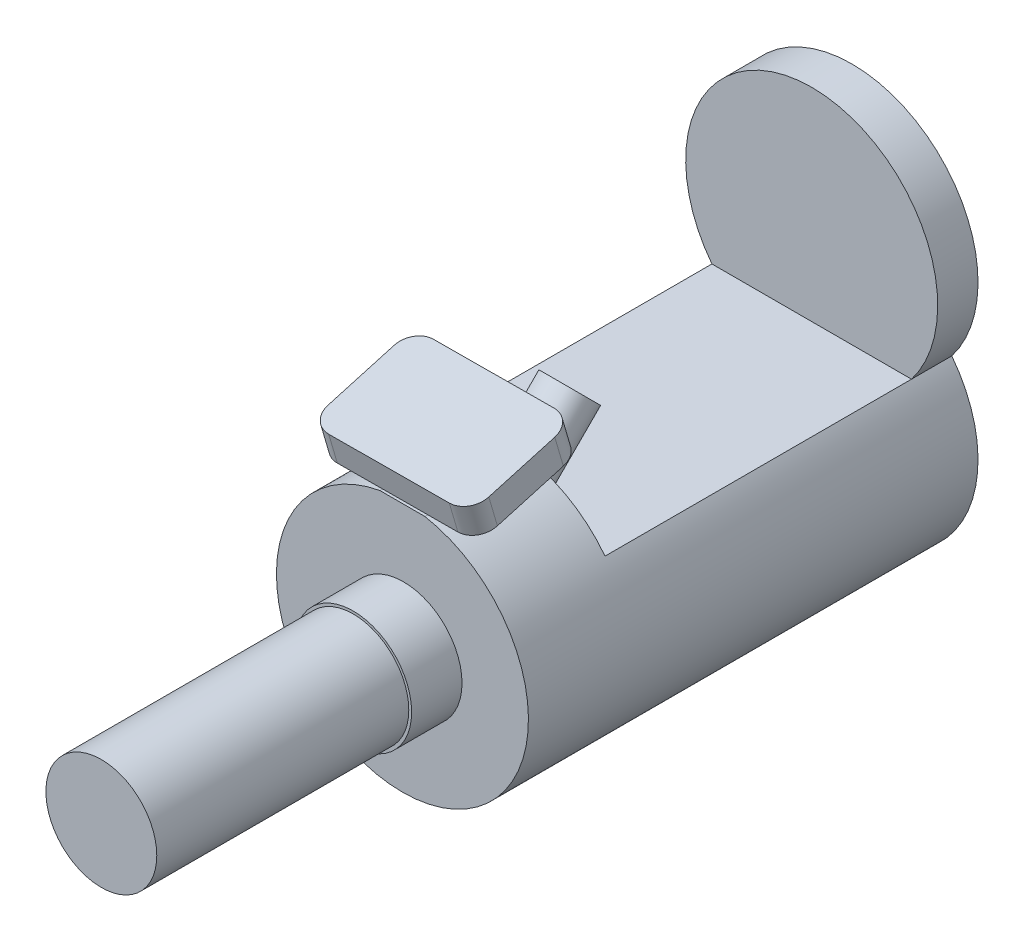
ISO-10303-21;
HEADER;
FILE_DESCRIPTION(('STEP AP214'),'2;1');
FILE_NAME('part.step','',(''),(''),'','','');
FILE_SCHEMA(('AUTOMOTIVE_DESIGN { 1 0 10303 214 1 1 1 1 }'));
ENDSEC;
DATA;
#1=APPLICATION_CONTEXT('core data for automotive mechanical design processes');
#2=APPLICATION_PROTOCOL_DEFINITION('international standard','automotive_design',2000,#1);
#3=PRODUCT_CONTEXT('',#1,'mechanical');
#4=PRODUCT('Part','Part','',(#3));
#5=PRODUCT_RELATED_PRODUCT_CATEGORY('part','',(#4));
#6=PRODUCT_DEFINITION_FORMATION('','',#4);
#7=PRODUCT_DEFINITION_CONTEXT('part definition',#1,'design');
#8=PRODUCT_DEFINITION('design','',#6,#7);
#9=PRODUCT_DEFINITION_SHAPE('','',#8);
#10=(LENGTH_UNIT() NAMED_UNIT(*) SI_UNIT(.MILLI.,.METRE.));
#11=(NAMED_UNIT(*) PLANE_ANGLE_UNIT() SI_UNIT($,.RADIAN.));
#12=(NAMED_UNIT(*) SI_UNIT($,.STERADIAN.) SOLID_ANGLE_UNIT());
#13=UNCERTAINTY_MEASURE_WITH_UNIT(LENGTH_MEASURE(1.E-05),#10,'distance_accuracy_value','');
#14=(GEOMETRIC_REPRESENTATION_CONTEXT(3) GLOBAL_UNCERTAINTY_ASSIGNED_CONTEXT((#13)) GLOBAL_UNIT_ASSIGNED_CONTEXT((#10,
#11,#12)) REPRESENTATION_CONTEXT('',''));
#15=CARTESIAN_POINT('',(0.,0.,0.));
#16=DIRECTION('',(0.,0.,1.));
#17=DIRECTION('',(1.,0.,0.));
#18=AXIS2_PLACEMENT_3D('',#15,#16,#17);
#19=CARTESIAN_POINT('',(-25.2236494622925,98.3744965262353,135.194832834219));
#20=DIRECTION('',(0.00927364020867443,-0.961523947640823,-0.274564560186648));
#21=DIRECTION('',(-0.0324577407303606,-0.274721127897378,0.960975960653269));
#22=AXIS2_PLACEMENT_3D('',#19,#20,#21);
#23=CYLINDRICAL_SURFACE('',#22,14.);
#24=CARTESIAN_POINT('',(-25.2236494622925,98.3744965262353,135.194832834219));
#25=DIRECTION('',(-0.00927364020867443,0.961523947640823,0.274564560186648));
#26=DIRECTION('',(0.0324577407303606,0.274721127897378,-0.960975960653269));
#27=AXIS2_PLACEMENT_3D('',#24,#25,#26);
#28=CIRCLE('',#27,14.);
#29=CARTESIAN_POINT('',(-24.7692410920675,102.220592316799,121.741169385073));
#30=VERTEX_POINT('',#29);
#31=EDGE_CURVE('P0_E10',#30,#30,#28,.T.);
#32=ORIENTED_EDGE('',*,*,#31,.F.);
#33=EDGE_LOOP('',(#32));
#34=FACE_BOUND('',#33,.T.);
#35=CARTESIAN_POINT('',(-25.1123657797885,86.8362091545455,131.900058111979));
#36=DIRECTION('',(0.,1.,0.));
#37=DIRECTION('',(0.0337565598964001,0.,-0.999430084930387));
#38=AXIS2_PLACEMENT_3D('',#35,#36,#37);
#39=ELLIPSE('',#38,14.560219778561,14.);
#40=CARTESIAN_POINT('',(-24.6208628487287,86.8362091545455,117.348136422087));
#41=VERTEX_POINT('',#40);
#42=EDGE_CURVE('P0_E21',#41,#41,#39,.T.);
#43=ORIENTED_EDGE('',*,*,#42,.T.);
#44=EDGE_LOOP('',(#43));
#45=FACE_BOUND('',#44,.T.);
#46=ADVANCED_FACE('P0_F15',(#34,#45),#23,.T.);
#47=CARTESIAN_POINT('',(-25.2236494622925,98.3744965262353,135.194832834219));
#48=DIRECTION('',(-0.00927364020867443,0.961523947640823,0.274564560186648));
#49=DIRECTION('',(0.0324577407303606,0.274721127897378,-0.960975960653269));
#50=AXIS2_PLACEMENT_3D('',#47,#48,#49);
#51=PLANE('',#50);
#52=ORIENTED_EDGE('',*,*,#31,.T.);
#53=EDGE_LOOP('',(#52));
#54=FACE_BOUND('',#53,.T.);
#55=ADVANCED_FACE('P0_F30',(#54),#51,.T.);
#56=CARTESIAN_POINT('',(-7.61412718210121,86.8362091545455,147.059597880007));
#57=DIRECTION('',(0.,1.,0.));
#58=DIRECTION('',(0.0337565598964001,0.,-0.999430084930387));
#59=AXIS2_PLACEMENT_3D('',#56,#57,#58);
#60=PLANE('',#59);
#61=ORIENTED_EDGE('',*,*,#42,.F.);
#62=EDGE_LOOP('',(#61));
#63=FACE_BOUND('',#62,.T.);
#64=ADVANCED_FACE('P0_F28',(#63),#60,.F.);
#65=CLOSED_SHELL('',(#46,#55,#64));
#66=MANIFOLD_SOLID_BREP('P0_B1',#65);
#67=CARTESIAN_POINT('',(-24.033694296179,25.3362091545455,156.834843864538));
#68=DIRECTION('',(0.,0.,-1.));
#69=DIRECTION('',(-1.,0.,0.));
#70=AXIS2_PLACEMENT_3D('',#67,#68,#69);
#71=CYLINDRICAL_SURFACE('',#70,62.5);
#72=DIRECTION('',(0.,0.,-1.));
#73=VECTOR('',#72,1.);
#74=CARTESIAN_POINT('',(-12.8981655705189,86.8362091545455,156.834843864538));
#75=LINE('',#74,#73);
#76=CARTESIAN_POINT('',(-12.8981655705189,86.8362091545455,156.834843864538));
#77=VERTEX_POINT('',#76);
#78=CARTESIAN_POINT('',(-12.8981655705189,86.8362091545455,105.834843864538));
#79=VERTEX_POINT('',#78);
#80=EDGE_CURVE('P1_E30',#77,#79,#75,.T.);
#81=ORIENTED_EDGE('',*,*,#80,.F.);
#82=CARTESIAN_POINT('',(-24.033694296179,25.3362091545455,156.834843864538));
#83=DIRECTION('',(0.,0.,1.));
#84=DIRECTION('',(1.,0.,0.));
#85=AXIS2_PLACEMENT_3D('',#82,#83,#84);
#86=CIRCLE('',#85,62.5);
#87=CARTESIAN_POINT('',(-35.169223021839,86.8362091545455,156.834843864538));
#88=VERTEX_POINT('',#87);
#89=EDGE_CURVE('P1_E24',#88,#77,#86,.T.);
#90=ORIENTED_EDGE('',*,*,#89,.F.);
#91=DIRECTION('',(0.,0.,-1.));
#92=VECTOR('',#91,1.);
#93=CARTESIAN_POINT('',(-35.169223021839,86.8362091545455,156.834843864538));
#94=LINE('',#93,#92);
#95=CARTESIAN_POINT('',(-35.169223021839,86.8362091545455,105.834843864538));
#96=VERTEX_POINT('',#95);
#97=EDGE_CURVE('P1_E56',#96,#88,#94,.F.);
#98=ORIENTED_EDGE('',*,*,#97,.F.);
#99=CARTESIAN_POINT('',(-24.033694296179,25.3362091545455,105.834843864538));
#100=DIRECTION('',(0.,0.,1.));
#101=DIRECTION('',(1.,0.,0.));
#102=AXIS2_PLACEMENT_3D('',#99,#100,#101);
#103=CIRCLE('',#102,62.5);
#104=CARTESIAN_POINT('',(-73.533694296179,63.4937772112233,105.834843864538));
#105=VERTEX_POINT('',#104);
#106=EDGE_CURVE('P1_E38',#96,#105,#103,.T.);
#107=ORIENTED_EDGE('',*,*,#106,.T.);
#108=DIRECTION('',(0.,0.,1.));
#109=VECTOR('',#108,1.);
#110=CARTESIAN_POINT('',(-73.533694296179,63.4937772112233,-700.625273365771));
#111=LINE('',#110,#109);
#112=CARTESIAN_POINT('',(-73.533694296179,63.4937772112233,-66.1651561354622));
#113=VERTEX_POINT('',#112);
#114=EDGE_CURVE('P1_E80',#113,#105,#111,.T.);
#115=ORIENTED_EDGE('',*,*,#114,.F.);
#116=CARTESIAN_POINT('',(-24.033694296179,25.3362091545455,-66.1651561354622));
#117=DIRECTION('',(0.,0.,1.));
#118=DIRECTION('',(1.,0.,0.));
#119=AXIS2_PLACEMENT_3D('',#116,#117,#118);
#120=CIRCLE('',#119,62.5);
#121=CARTESIAN_POINT('',(25.466305703821,63.4937772112233,-66.1651561354622));
#122=VERTEX_POINT('',#121);
#123=EDGE_CURVE('P1_E76',#113,#122,#120,.T.);
#124=ORIENTED_EDGE('',*,*,#123,.T.);
#125=DIRECTION('',(0.,0.,1.));
#126=VECTOR('',#125,1.);
#127=CARTESIAN_POINT('',(25.466305703821,63.4937772112233,-700.625273365771));
#128=LINE('',#127,#126);
#129=CARTESIAN_POINT('',(25.466305703821,63.4937772112233,105.834843864538));
#130=VERTEX_POINT('',#129);
#131=EDGE_CURVE('P1_E74',#122,#130,#128,.T.);
#132=ORIENTED_EDGE('',*,*,#131,.T.);
#133=EDGE_CURVE('P1_E68',#130,#79,#103,.T.);
#134=ORIENTED_EDGE('',*,*,#133,.T.);
#135=EDGE_LOOP('',(#81,#90,#98,#107,#115,#124,#132,#134));
#136=FACE_BOUND('',#135,.T.);
#137=ADVANCED_FACE('P1_F17',(#136),#71,.T.);
#138=CARTESIAN_POINT('',(-24.033694296179,25.3362091545455,156.834843864538));
#139=DIRECTION('',(0.,0.,1.));
#140=DIRECTION('',(1.,0.,0.));
#141=AXIS2_PLACEMENT_3D('',#138,#139,#140);
#142=PLANE('',#141);
#143=ORIENTED_EDGE('',*,*,#89,.T.);
#144=DIRECTION('',(-1.,0.,0.));
#145=VECTOR('',#144,1.);
#146=CARTESIAN_POINT('',(87.4663057038211,86.8362091545455,156.834843864538));
#147=LINE('',#146,#145);
#148=EDGE_CURVE('P1_E62',#77,#88,#147,.T.);
#149=ORIENTED_EDGE('',*,*,#148,.T.);
#150=EDGE_LOOP('',(#143,#149));
#151=FACE_BOUND('',#150,.T.);
#152=ADVANCED_FACE('P1_F87',(#151),#142,.T.);
#153=CARTESIAN_POINT('',(-24.033694296179,25.3362091545455,105.834843864538));
#154=DIRECTION('',(0.,0.,1.));
#155=DIRECTION('',(1.,0.,0.));
#156=AXIS2_PLACEMENT_3D('',#153,#154,#155);
#157=PLANE('',#156);
#158=DIRECTION('',(-1.,0.,0.));
#159=VECTOR('',#158,1.);
#160=CARTESIAN_POINT('',(-24.033694296179,86.8362091545455,105.834843864538));
#161=LINE('',#160,#159);
#162=EDGE_CURVE('P1_E11',#79,#96,#161,.T.);
#163=ORIENTED_EDGE('',*,*,#162,.F.);
#164=ORIENTED_EDGE('',*,*,#133,.F.);
#165=DIRECTION('',(1.,0.,0.));
#166=VECTOR('',#165,1.);
#167=CARTESIAN_POINT('',(25.466305703821,63.4937772112233,105.834843864538));
#168=LINE('',#167,#166);
#169=EDGE_CURVE('P1_E67',#105,#130,#168,.T.);
#170=ORIENTED_EDGE('',*,*,#169,.F.);
#171=ORIENTED_EDGE('',*,*,#106,.F.);
#172=EDGE_LOOP('',(#163,#164,#170,#171));
#173=FACE_BOUND('',#172,.T.);
#174=ADVANCED_FACE('P1_F65',(#173),#157,.F.);
#175=CARTESIAN_POINT('',(-24.033694296179,25.3362091545455,-66.1651561354622));
#176=DIRECTION('',(0.,0.,1.));
#177=DIRECTION('',(1.,0.,0.));
#178=AXIS2_PLACEMENT_3D('',#175,#176,#177);
#179=PLANE('',#178);
#180=ORIENTED_EDGE('',*,*,#123,.F.);
#181=DIRECTION('',(1.,0.,0.));
#182=VECTOR('',#181,1.);
#183=CARTESIAN_POINT('',(25.466305703821,63.4937772112233,-66.1651561354622));
#184=LINE('',#183,#182);
#185=EDGE_CURVE('P1_E70',#113,#122,#184,.T.);
#186=ORIENTED_EDGE('',*,*,#185,.T.);
#187=EDGE_LOOP('',(#180,#186));
#188=FACE_BOUND('',#187,.T.);
#189=ADVANCED_FACE('P1_F90',(#188),#179,.F.);
#190=CARTESIAN_POINT('',(25.466305703821,63.4937772112233,-700.625273365771));
#191=DIRECTION('',(0.,1.,0.));
#192=DIRECTION('',(0.,0.,1.));
#193=AXIS2_PLACEMENT_3D('',#190,#191,#192);
#194=PLANE('',#193);
#195=ORIENTED_EDGE('',*,*,#185,.F.);
#196=ORIENTED_EDGE('',*,*,#114,.T.);
#197=ORIENTED_EDGE('',*,*,#169,.T.);
#198=ORIENTED_EDGE('',*,*,#131,.F.);
#199=EDGE_LOOP('',(#195,#196,#197,#198));
#200=FACE_BOUND('',#199,.T.);
#201=ADVANCED_FACE('P1_F88',(#200),#194,.T.);
#202=CARTESIAN_POINT('',(87.4663057038211,86.8362091545455,105.834843864538));
#203=DIRECTION('',(0.,1.,0.));
#204=DIRECTION('',(0.,0.,1.));
#205=AXIS2_PLACEMENT_3D('',#202,#203,#204);
#206=PLANE('',#205);
#207=ORIENTED_EDGE('',*,*,#80,.T.);
#208=ORIENTED_EDGE('',*,*,#162,.T.);
#209=ORIENTED_EDGE('',*,*,#97,.T.);
#210=ORIENTED_EDGE('',*,*,#148,.F.);
#211=EDGE_LOOP('',(#207,#208,#209,#210));
#212=FACE_BOUND('',#211,.T.);
#213=ADVANCED_FACE('P1_F55',(#212),#206,.T.);
#214=CLOSED_SHELL('',(#137,#152,#174,#189,#201,#213));
#215=MANIFOLD_SOLID_BREP('P1_B1',#214);
#216=CARTESIAN_POINT('',(-24.033694296179,101.651345267901,-46.1651561354622));
#217=DIRECTION('',(0.,0.,-1.));
#218=DIRECTION('',(1.,0.,0.));
#219=AXIS2_PLACEMENT_3D('',#216,#217,#218);
#220=CYLINDRICAL_SURFACE('',#219,62.5);
#221=CARTESIAN_POINT('',(-24.033694296179,101.651345267901,-66.1651561354622));
#222=DIRECTION('',(0.,0.,1.));
#223=DIRECTION('',(-1.,0.,0.));
#224=AXIS2_PLACEMENT_3D('',#221,#222,#223);
#225=CIRCLE('',#224,62.5);
#226=CARTESIAN_POINT('',(25.466305703821,63.4937772112233,-66.1651561354622));
#227=VERTEX_POINT('',#226);
#228=CARTESIAN_POINT('',(-73.533694296179,63.4937772112233,-66.1651561354622));
#229=VERTEX_POINT('',#228);
#230=EDGE_CURVE('P2_E48',#227,#229,#225,.T.);
#231=ORIENTED_EDGE('',*,*,#230,.T.);
#232=DIRECTION('',(0.,0.,-1.));
#233=VECTOR('',#232,1.);
#234=CARTESIAN_POINT('',(-73.533694296179,63.4937772112233,-46.1651561354622));
#235=LINE('',#234,#233);
#236=CARTESIAN_POINT('',(-73.533694296179,63.4937772112233,-46.1651561354622));
#237=VERTEX_POINT('',#236);
#238=EDGE_CURVE('P2_E11',#237,#229,#235,.T.);
#239=ORIENTED_EDGE('',*,*,#238,.F.);
#240=CARTESIAN_POINT('',(-24.033694296179,101.651345267901,-46.1651561354622));
#241=DIRECTION('',(0.,0.,1.));
#242=DIRECTION('',(-1.,0.,0.));
#243=AXIS2_PLACEMENT_3D('',#240,#241,#242);
#244=CIRCLE('',#243,62.5);
#245=CARTESIAN_POINT('',(25.466305703821,63.4937772112233,-46.1651561354622));
#246=VERTEX_POINT('',#245);
#247=EDGE_CURVE('P2_E47',#246,#237,#244,.T.);
#248=ORIENTED_EDGE('',*,*,#247,.F.);
#249=DIRECTION('',(0.,0.,-1.));
#250=VECTOR('',#249,1.);
#251=CARTESIAN_POINT('',(25.466305703821,63.4937772112233,-46.1651561354622));
#252=LINE('',#251,#250);
#253=EDGE_CURVE('P2_E25',#246,#227,#252,.T.);
#254=ORIENTED_EDGE('',*,*,#253,.T.);
#255=EDGE_LOOP('',(#231,#239,#248,#254));
#256=FACE_BOUND('',#255,.T.);
#257=ADVANCED_FACE('P2_F17',(#256),#220,.T.);
#258=CARTESIAN_POINT('',(25.466305703821,63.4937772112233,-46.1651561354622));
#259=DIRECTION('',(0.,1.,0.));
#260=DIRECTION('',(0.,0.,-1.));
#261=AXIS2_PLACEMENT_3D('',#258,#259,#260);
#262=PLANE('',#261);
#263=DIRECTION('',(1.,0.,0.));
#264=VECTOR('',#263,1.);
#265=CARTESIAN_POINT('',(25.466305703821,63.4937772112233,-66.1651561354622));
#266=LINE('',#265,#264);
#267=EDGE_CURVE('P2_E40',#229,#227,#266,.T.);
#268=ORIENTED_EDGE('',*,*,#267,.T.);
#269=ORIENTED_EDGE('',*,*,#253,.F.);
#270=DIRECTION('',(1.,0.,0.));
#271=VECTOR('',#270,1.);
#272=CARTESIAN_POINT('',(25.466305703821,63.4937772112233,-46.1651561354622));
#273=LINE('',#272,#271);
#274=EDGE_CURVE('P2_E32',#237,#246,#273,.T.);
#275=ORIENTED_EDGE('',*,*,#274,.F.);
#276=ORIENTED_EDGE('',*,*,#238,.T.);
#277=EDGE_LOOP('',(#268,#269,#275,#276));
#278=FACE_BOUND('',#277,.T.);
#279=ADVANCED_FACE('P2_F43',(#278),#262,.F.);
#280=CARTESIAN_POINT('',(-24.033694296179,101.651345267901,-46.1651561354622));
#281=DIRECTION('',(0.,0.,1.));
#282=DIRECTION('',(-1.,0.,0.));
#283=AXIS2_PLACEMENT_3D('',#280,#281,#282);
#284=PLANE('',#283);
#285=ORIENTED_EDGE('',*,*,#247,.T.);
#286=ORIENTED_EDGE('',*,*,#274,.T.);
#287=EDGE_LOOP('',(#285,#286));
#288=FACE_BOUND('',#287,.T.);
#289=ADVANCED_FACE('P2_F55',(#288),#284,.T.);
#290=CARTESIAN_POINT('',(-24.033694296179,101.651345267901,-66.1651561354622));
#291=DIRECTION('',(0.,0.,1.));
#292=DIRECTION('',(-1.,0.,0.));
#293=AXIS2_PLACEMENT_3D('',#290,#291,#292);
#294=PLANE('',#293);
#295=ORIENTED_EDGE('',*,*,#230,.F.);
#296=ORIENTED_EDGE('',*,*,#267,.F.);
#297=EDGE_LOOP('',(#295,#296));
#298=FACE_BOUND('',#297,.T.);
#299=ADVANCED_FACE('P2_F51',(#298),#294,.F.);
#300=CLOSED_SHELL('',(#257,#279,#289,#299));
#301=MANIFOLD_SOLID_BREP('P2_B1',#300);
#302=CARTESIAN_POINT('',(-63.4416356455557,105.39719338341,163.942493989306));
#303=DIRECTION('',(0.99995669799352,0.00870420549286276,0.00329225525048523));
#304=DIRECTION('',(0.000775715912165713,0.274583202180952,-0.961563031394655));
#305=AXIS2_PLACEMENT_3D('',#302,#303,#304);
#306=PLANE('',#305);
#307=DIRECTION('',(-0.000775715912165713,-0.274583202180952,0.961563031394655));
#308=VECTOR('',#307,1.);
#309=CARTESIAN_POINT('',(-63.4416356455557,105.39719338341,163.942493989306));
#310=LINE('',#309,#308);
#311=CARTESIAN_POINT('',(-63.4075041454204,117.478854279372,121.633720607941));
#312=VERTEX_POINT('',#311);
#313=CARTESIAN_POINT('',(-63.433878486434,108.143025405219,154.326863675359));
#314=VERTEX_POINT('',#313);
#315=EDGE_CURVE('P3_E109',#312,#314,#310,.T.);
#316=ORIENTED_EDGE('',*,*,#315,.F.);
#317=DIRECTION('',(0.0092736402086744,-0.961523947640823,-0.274564560186648));
#318=VECTOR('',#317,1.);
#319=CARTESIAN_POINT('',(-63.4075041454204,117.478854279372,121.633720607941));
#320=LINE('',#319,#318);
#321=CARTESIAN_POINT('',(-63.2683995422903,103.055995064759,117.515252205141));
#322=VERTEX_POINT('',#321);
#323=EDGE_CURVE('P3_E135',#312,#322,#320,.T.);
#324=ORIENTED_EDGE('',*,*,#323,.T.);
#325=DIRECTION('',(-0.000775715912165713,-0.274583202180952,0.961563031394655));
#326=VECTOR('',#325,1.);
#327=CARTESIAN_POINT('',(-63.3025310424256,90.9743341687975,159.824025586506));
#328=LINE('',#327,#326);
#329=CARTESIAN_POINT('',(-63.2947738833039,93.720166190607,150.208395272559));
#330=VERTEX_POINT('',#329);
#331=EDGE_CURVE('P3_E141',#322,#330,#328,.T.);
#332=ORIENTED_EDGE('',*,*,#331,.T.);
#333=DIRECTION('',(0.0092736402086744,-0.961523947640823,-0.274564560186648));
#334=VECTOR('',#333,1.);
#335=CARTESIAN_POINT('',(-63.433878486434,108.143025405219,154.326863675359));
#336=LINE('',#335,#334);
#337=EDGE_CURVE('P3_E133',#330,#314,#336,.F.);
#338=ORIENTED_EDGE('',*,*,#337,.T.);
#339=EDGE_LOOP('',(#316,#324,#332,#338));
#340=FACE_BOUND('',#339,.T.);
#341=ADVANCED_FACE('P3_F17',(#340),#306,.F.);
#342=CARTESIAN_POINT('',(16.5549001939259,106.093529822839,164.205874409344));
#343=DIRECTION('',(0.0007757159121658,0.274583202180952,-0.961563031394655));
#344=DIRECTION('',(-0.99995669799352,-0.00870420549286273,-0.00329225525048531));
#345=AXIS2_PLACEMENT_3D('',#342,#343,#344);
#346=PLANE('',#345);
#347=DIRECTION('',(0.99995669799352,0.00870420549286273,0.00329225525048531));
#348=VECTOR('',#347,1.);
#349=CARTESIAN_POINT('',(16.5549001939259,106.093529822839,164.205874409344));
#350=LINE('',#349,#348);
#351=CARTESIAN_POINT('',(-53.4420686656205,105.484235438338,163.97541654181));
#352=VERTEX_POINT('',#351);
#353=CARTESIAN_POINT('',(6.55533321399068,106.00648776791,164.172951856839));
#354=VERTEX_POINT('',#353);
#355=EDGE_CURVE('P3_E112',#352,#354,#350,.T.);
#356=ORIENTED_EDGE('',*,*,#355,.F.);
#357=DIRECTION('',(0.0092736402086744,-0.961523947640823,-0.274564560186648));
#358=VECTOR('',#357,1.);
#359=CARTESIAN_POINT('',(-53.4420686656205,105.484235438338,163.97541654181));
#360=LINE('',#359,#358);
#361=CARTESIAN_POINT('',(-53.3029640624904,91.0613762237261,159.856948139011));
#362=VERTEX_POINT('',#361);
#363=EDGE_CURVE('P3_E11',#352,#362,#360,.T.);
#364=ORIENTED_EDGE('',*,*,#363,.T.);
#365=DIRECTION('',(0.99995669799352,0.00870420549286273,0.00329225525048531));
#366=VECTOR('',#365,1.);
#367=CARTESIAN_POINT('',(16.694004797056,91.6706706082265,160.087406006545));
#368=LINE('',#367,#366);
#369=CARTESIAN_POINT('',(6.6944378171208,91.5836285532979,160.05448345404));
#370=VERTEX_POINT('',#369);
#371=EDGE_CURVE('P3_E114',#362,#370,#368,.T.);
#372=ORIENTED_EDGE('',*,*,#371,.T.);
#373=DIRECTION('',(0.0092736402086744,-0.961523947640823,-0.274564560186648));
#374=VECTOR('',#373,1.);
#375=CARTESIAN_POINT('',(6.55533321399068,106.00648776791,164.172951856839));
#376=LINE('',#375,#374);
#377=EDGE_CURVE('P3_E25',#370,#354,#376,.F.);
#378=ORIENTED_EDGE('',*,*,#377,.T.);
#379=EDGE_LOOP('',(#356,#364,#372,#378));
#380=FACE_BOUND('',#379,.T.);
#381=ADVANCED_FACE('P3_F160',(#380),#346,.F.);
#382=CARTESIAN_POINT('',(16.5967888531828,120.92102274061,112.281470714033));
#383=DIRECTION('',(-0.99995669799352,-0.00870420549286269,-0.00329225525048547));
#384=DIRECTION('',(-0.00077571591216597,-0.274583202180952,0.961563031394655));
#385=AXIS2_PLACEMENT_3D('',#382,#383,#384);
#386=PLANE('',#385);
#387=DIRECTION('',(0.00077571591216597,0.274583202180952,-0.961563031394655));
#388=VECTOR('',#387,1.);
#389=CARTESIAN_POINT('',(16.735893456313,106.498163525998,108.163002311233));
#390=LINE('',#389,#388);
#391=CARTESIAN_POINT('',(16.7017619561777,94.416502630036,150.471775692598));
#392=VERTEX_POINT('',#391);
#393=CARTESIAN_POINT('',(16.7281362971913,103.752331504188,117.77863262518));
#394=VERTEX_POINT('',#393);
#395=EDGE_CURVE('P3_E110',#392,#394,#390,.T.);
#396=ORIENTED_EDGE('',*,*,#395,.T.);
#397=DIRECTION('',(0.0092736402086744,-0.961523947640823,-0.274564560186648));
#398=VECTOR('',#397,1.);
#399=CARTESIAN_POINT('',(16.5890316940612,118.175190718801,121.89710102798));
#400=LINE('',#399,#398);
#401=CARTESIAN_POINT('',(16.5890316940612,118.175190718801,121.89710102798));
#402=VERTEX_POINT('',#401);
#403=EDGE_CURVE('P3_E88',#394,#402,#400,.F.);
#404=ORIENTED_EDGE('',*,*,#403,.T.);
#405=DIRECTION('',(0.00077571591216597,0.274583202180952,-0.961563031394655));
#406=VECTOR('',#405,1.);
#407=CARTESIAN_POINT('',(16.5967888531828,120.92102274061,112.281470714033));
#408=LINE('',#407,#406);
#409=CARTESIAN_POINT('',(16.5626573530475,108.839361844648,154.590244095398));
#410=VERTEX_POINT('',#409);
#411=EDGE_CURVE('P3_E149',#410,#402,#408,.T.);
#412=ORIENTED_EDGE('',*,*,#411,.F.);
#413=DIRECTION('',(0.0092736402086744,-0.961523947640823,-0.274564560186648));
#414=VECTOR('',#413,1.);
#415=CARTESIAN_POINT('',(16.5626573530475,108.839361844648,154.590244095398));
#416=LINE('',#415,#414);
#417=EDGE_CURVE('P3_E93',#410,#392,#416,.T.);
#418=ORIENTED_EDGE('',*,*,#417,.T.);
#419=EDGE_LOOP('',(#396,#404,#412,#418));
#420=FACE_BOUND('',#419,.T.);
#421=ADVANCED_FACE('P3_F159',(#420),#386,.F.);
#422=CARTESIAN_POINT('',(-63.3997469862988,120.224686301181,112.018090293994));
#423=DIRECTION('',(-0.000775715912165713,-0.274583202180952,0.961563031394655));
#424=DIRECTION('',(0.0092736402086744,-0.961523947640823,-0.274564560186648));
#425=AXIS2_PLACEMENT_3D('',#422,#423,#424);
#426=PLANE('',#425);
#427=DIRECTION('',(-0.99995669799352,-0.00870420549286276,-0.00329225525048523));
#428=VECTOR('',#427,1.);
#429=CARTESIAN_POINT('',(-63.3997469862988,120.224686301181,112.018090293994));
#430=LINE('',#429,#428);
#431=CARTESIAN_POINT('',(6.59722187324764,120.833980685682,112.248548161528));
#432=VERTEX_POINT('',#431);
#433=CARTESIAN_POINT('',(-53.4001800063636,120.31172835611,112.051012846499));
#434=VERTEX_POINT('',#433);
#435=EDGE_CURVE('P3_E103',#432,#434,#430,.T.);
#436=ORIENTED_EDGE('',*,*,#435,.F.);
#437=DIRECTION('',(0.0092736402086744,-0.961523947640823,-0.274564560186648));
#438=VECTOR('',#437,1.);
#439=CARTESIAN_POINT('',(6.59722187324764,120.833980685682,112.248548161528));
#440=LINE('',#439,#438);
#441=CARTESIAN_POINT('',(6.73632647637776,106.411121471069,108.130079758728));
#442=VERTEX_POINT('',#441);
#443=EDGE_CURVE('P3_E87',#432,#442,#440,.T.);
#444=ORIENTED_EDGE('',*,*,#443,.T.);
#445=DIRECTION('',(-0.99995669799352,-0.00870420549286276,-0.00329225525048523));
#446=VECTOR('',#445,1.);
#447=CARTESIAN_POINT('',(-63.2606423831686,105.801827086569,107.899621891194));
#448=LINE('',#447,#446);
#449=CARTESIAN_POINT('',(-53.2610754032334,105.888869141498,107.932544443699));
#450=VERTEX_POINT('',#449);
#451=EDGE_CURVE('P3_E100',#442,#450,#448,.T.);
#452=ORIENTED_EDGE('',*,*,#451,.T.);
#453=DIRECTION('',(0.0092736402086744,-0.961523947640823,-0.274564560186648));
#454=VECTOR('',#453,1.);
#455=CARTESIAN_POINT('',(-53.4001800063636,120.31172835611,112.051012846499));
#456=LINE('',#455,#454);
#457=EDGE_CURVE('P3_E105',#450,#434,#456,.F.);
#458=ORIENTED_EDGE('',*,*,#457,.T.);
#459=EDGE_LOOP('',(#436,#444,#452,#458));
#460=FACE_BOUND('',#459,.T.);
#461=ADVANCED_FACE('P3_F99',(#460),#426,.F.);
#462=CARTESIAN_POINT('',(-63.3997469862988,120.224686301181,112.018090293994));
#463=DIRECTION('',(0.0092736402086744,-0.961523947640823,-0.274564560186648));
#464=DIRECTION('',(-0.99995669799352,-0.00870420549286276,-0.00329225525048523));
#465=AXIS2_PLACEMENT_3D('',#462,#463,#464);
#466=PLANE('',#465);
#467=ORIENTED_EDGE('',*,*,#411,.T.);
#468=CARTESIAN_POINT('',(6.58946471412598,118.088148663872,121.864178475475));
#469=DIRECTION('',(0.0092736402086744,-0.961523947640823,-0.274564560186648));
#470=DIRECTION('',(-0.99995669799352,-0.00870420549286276,-0.00329225525048523));
#471=AXIS2_PLACEMENT_3D('',#468,#469,#470);
#472=CIRCLE('',#471,10.);
#473=EDGE_CURVE('P3_E131',#402,#432,#472,.F.);
#474=ORIENTED_EDGE('',*,*,#473,.T.);
#475=ORIENTED_EDGE('',*,*,#435,.T.);
#476=CARTESIAN_POINT('',(-53.4079371654852,117.5658963343,121.666643160446));
#477=DIRECTION('',(0.0092736402086744,-0.961523947640823,-0.274564560186648));
#478=DIRECTION('',(-0.99995669799352,-0.00870420549286276,-0.00329225525048523));
#479=AXIS2_PLACEMENT_3D('',#476,#477,#478);
#480=CIRCLE('',#479,10.);
#481=EDGE_CURVE('P3_E129',#434,#312,#480,.F.);
#482=ORIENTED_EDGE('',*,*,#481,.T.);
#483=ORIENTED_EDGE('',*,*,#315,.T.);
#484=CARTESIAN_POINT('',(-53.4343115064989,108.230067460148,154.359786227864));
#485=DIRECTION('',(0.0092736402086744,-0.961523947640823,-0.274564560186648));
#486=DIRECTION('',(-0.99995669799352,-0.00870420549286276,-0.00329225525048523));
#487=AXIS2_PLACEMENT_3D('',#484,#485,#486);
#488=CIRCLE('',#487,10.);
#489=EDGE_CURVE('P3_E38',#314,#352,#488,.F.);
#490=ORIENTED_EDGE('',*,*,#489,.T.);
#491=ORIENTED_EDGE('',*,*,#355,.T.);
#492=CARTESIAN_POINT('',(6.56309037311234,108.75231978972,154.557321542893));
#493=DIRECTION('',(0.0092736402086744,-0.961523947640823,-0.274564560186648));
#494=DIRECTION('',(-0.99995669799352,-0.00870420549286276,-0.00329225525048523));
#495=AXIS2_PLACEMENT_3D('',#492,#493,#494);
#496=CIRCLE('',#495,10.);
#497=EDGE_CURVE('P3_E126',#354,#410,#496,.F.);
#498=ORIENTED_EDGE('',*,*,#497,.T.);
#499=EDGE_LOOP('',(#467,#474,#475,#482,#483,#490,#491,#498));
#500=FACE_BOUND('',#499,.T.);
#501=ADVANCED_FACE('P3_F153',(#500),#466,.F.);
#502=CARTESIAN_POINT('',(-63.2606423831686,105.801827086569,107.899621891194));
#503=DIRECTION('',(0.0092736402086744,-0.961523947640823,-0.274564560186648));
#504=DIRECTION('',(-0.99995669799352,-0.00870420549286276,-0.00329225525048523));
#505=AXIS2_PLACEMENT_3D('',#502,#503,#504);
#506=PLANE('',#505);
#507=ORIENTED_EDGE('',*,*,#451,.F.);
#508=CARTESIAN_POINT('',(6.7285693172561,103.66528944926,117.745710072675));
#509=DIRECTION('',(0.0092736402086744,-0.961523947640823,-0.274564560186648));
#510=DIRECTION('',(-0.99995669799352,-0.00870420549286276,-0.00329225525048523));
#511=AXIS2_PLACEMENT_3D('',#508,#509,#510);
#512=CIRCLE('',#511,10.);
#513=EDGE_CURVE('P3_E83',#442,#394,#512,.T.);
#514=ORIENTED_EDGE('',*,*,#513,.T.);
#515=ORIENTED_EDGE('',*,*,#395,.F.);
#516=CARTESIAN_POINT('',(6.70219497624246,94.3294605751074,150.438853140093));
#517=DIRECTION('',(0.0092736402086744,-0.961523947640823,-0.274564560186648));
#518=DIRECTION('',(-0.99995669799352,-0.00870420549286276,-0.00329225525048523));
#519=AXIS2_PLACEMENT_3D('',#516,#517,#518);
#520=CIRCLE('',#519,10.);
#521=EDGE_CURVE('P3_E104',#392,#370,#520,.T.);
#522=ORIENTED_EDGE('',*,*,#521,.T.);
#523=ORIENTED_EDGE('',*,*,#371,.F.);
#524=CARTESIAN_POINT('',(-53.2952069033687,93.8072082455356,150.241317825064));
#525=DIRECTION('',(0.0092736402086744,-0.961523947640823,-0.274564560186648));
#526=DIRECTION('',(-0.99995669799352,-0.00870420549286276,-0.00329225525048523));
#527=AXIS2_PLACEMENT_3D('',#524,#525,#526);
#528=CIRCLE('',#527,10.);
#529=EDGE_CURVE('P3_E120',#362,#330,#528,.T.);
#530=ORIENTED_EDGE('',*,*,#529,.T.);
#531=ORIENTED_EDGE('',*,*,#331,.F.);
#532=CARTESIAN_POINT('',(-53.2688325623551,103.143037119688,117.548174757646));
#533=DIRECTION('',(0.0092736402086744,-0.961523947640823,-0.274564560186648));
#534=DIRECTION('',(-0.99995669799352,-0.00870420549286276,-0.00329225525048523));
#535=AXIS2_PLACEMENT_3D('',#532,#533,#534);
#536=CIRCLE('',#535,10.);
#537=EDGE_CURVE('P3_E94',#322,#450,#536,.T.);
#538=ORIENTED_EDGE('',*,*,#537,.T.);
#539=EDGE_LOOP('',(#507,#514,#515,#522,#523,#530,#531,#538));
#540=FACE_BOUND('',#539,.T.);
#541=ADVANCED_FACE('P3_F107',(#540),#506,.T.);
#542=CARTESIAN_POINT('',(6.58946471412598,118.088148663872,121.864178475475));
#543=DIRECTION('',(0.0092736402086744,-0.961523947640823,-0.274564560186648));
#544=DIRECTION('',(-0.99995669799352,-0.00870420549286276,-0.00329225525048523));
#545=AXIS2_PLACEMENT_3D('',#542,#543,#544);
#546=CYLINDRICAL_SURFACE('',#545,10.);
#547=ORIENTED_EDGE('',*,*,#473,.F.);
#548=ORIENTED_EDGE('',*,*,#403,.F.);
#549=ORIENTED_EDGE('',*,*,#513,.F.);
#550=ORIENTED_EDGE('',*,*,#443,.F.);
#551=EDGE_LOOP('',(#547,#548,#549,#550));
#552=FACE_BOUND('',#551,.T.);
#553=ADVANCED_FACE('P3_F86',(#552),#546,.T.);
#554=CARTESIAN_POINT('',(-53.4079371654852,117.5658963343,121.666643160446));
#555=DIRECTION('',(0.0092736402086744,-0.961523947640823,-0.274564560186648));
#556=DIRECTION('',(-0.99995669799352,-0.00870420549286276,-0.00329225525048523));
#557=AXIS2_PLACEMENT_3D('',#554,#555,#556);
#558=CYLINDRICAL_SURFACE('',#557,10.);
#559=ORIENTED_EDGE('',*,*,#481,.F.);
#560=ORIENTED_EDGE('',*,*,#457,.F.);
#561=ORIENTED_EDGE('',*,*,#537,.F.);
#562=ORIENTED_EDGE('',*,*,#323,.F.);
#563=EDGE_LOOP('',(#559,#560,#561,#562));
#564=FACE_BOUND('',#563,.T.);
#565=ADVANCED_FACE('P3_F163',(#564),#558,.T.);
#566=CARTESIAN_POINT('',(-53.4343115064989,108.230067460148,154.359786227864));
#567=DIRECTION('',(0.0092736402086744,-0.961523947640823,-0.274564560186648));
#568=DIRECTION('',(-0.99995669799352,-0.00870420549286276,-0.00329225525048523));
#569=AXIS2_PLACEMENT_3D('',#566,#567,#568);
#570=CYLINDRICAL_SURFACE('',#569,10.);
#571=ORIENTED_EDGE('',*,*,#489,.F.);
#572=ORIENTED_EDGE('',*,*,#337,.F.);
#573=ORIENTED_EDGE('',*,*,#529,.F.);
#574=ORIENTED_EDGE('',*,*,#363,.F.);
#575=EDGE_LOOP('',(#571,#572,#573,#574));
#576=FACE_BOUND('',#575,.T.);
#577=ADVANCED_FACE('P3_F162',(#576),#570,.T.);
#578=CARTESIAN_POINT('',(6.56309037311234,108.75231978972,154.557321542893));
#579=DIRECTION('',(0.0092736402086744,-0.961523947640823,-0.274564560186648));
#580=DIRECTION('',(-0.99995669799352,-0.00870420549286276,-0.00329225525048523));
#581=AXIS2_PLACEMENT_3D('',#578,#579,#580);
#582=CYLINDRICAL_SURFACE('',#581,10.);
#583=ORIENTED_EDGE('',*,*,#497,.F.);
#584=ORIENTED_EDGE('',*,*,#377,.F.);
#585=ORIENTED_EDGE('',*,*,#521,.F.);
#586=ORIENTED_EDGE('',*,*,#417,.F.);
#587=EDGE_LOOP('',(#583,#584,#585,#586));
#588=FACE_BOUND('',#587,.T.);
#589=ADVANCED_FACE('P3_F19',(#588),#582,.T.);
#590=CLOSED_SHELL('',(#341,#381,#421,#461,#501,#541,#553,#565,#577,#589));
#591=MANIFOLD_SOLID_BREP('P3_B1',#590);
#592=CARTESIAN_POINT('',(-23.4787281570776,24.4773402800527,181.834843864538));
#593=DIRECTION('',(0.,0.,-1.));
#594=DIRECTION('',(-1.,0.,0.));
#595=AXIS2_PLACEMENT_3D('',#592,#593,#594);
#596=CYLINDRICAL_SURFACE('',#595,29.);
#597=CARTESIAN_POINT('',(-23.4787281570776,24.4773402800527,181.834843864538));
#598=DIRECTION('',(0.,0.,1.));
#599=DIRECTION('',(1.,0.,0.));
#600=AXIS2_PLACEMENT_3D('',#597,#598,#599);
#601=CIRCLE('',#600,29.);
#602=CARTESIAN_POINT('',(5.52127184292242,24.4773402800527,181.834843864538));
#603=VERTEX_POINT('',#602);
#604=EDGE_CURVE('P4_E9',#603,#603,#601,.T.);
#605=ORIENTED_EDGE('',*,*,#604,.F.);
#606=EDGE_LOOP('',(#605));
#607=FACE_BOUND('',#606,.T.);
#608=CARTESIAN_POINT('',(-23.4787281570776,24.4773402800527,156.834843864538));
#609=DIRECTION('',(0.,0.,1.));
#610=DIRECTION('',(1.,0.,0.));
#611=AXIS2_PLACEMENT_3D('',#608,#609,#610);
#612=CIRCLE('',#611,29.);
#613=CARTESIAN_POINT('',(5.52127184292242,24.4773402800527,156.834843864538));
#614=VERTEX_POINT('',#613);
#615=EDGE_CURVE('P4_E17',#614,#614,#612,.T.);
#616=ORIENTED_EDGE('',*,*,#615,.T.);
#617=EDGE_LOOP('',(#616));
#618=FACE_BOUND('',#617,.T.);
#619=ADVANCED_FACE('P4_F14',(#607,#618),#596,.T.);
#620=CARTESIAN_POINT('',(-23.4787281570776,24.4773402800527,181.834843864538));
#621=DIRECTION('',(0.,0.,1.));
#622=DIRECTION('',(1.,0.,0.));
#623=AXIS2_PLACEMENT_3D('',#620,#621,#622);
#624=PLANE('',#623);
#625=ORIENTED_EDGE('',*,*,#604,.T.);
#626=EDGE_LOOP('',(#625));
#627=FACE_BOUND('',#626,.T.);
#628=ADVANCED_FACE('P4_F29',(#627),#624,.T.);
#629=CARTESIAN_POINT('',(-23.4787281570776,24.4773402800527,156.834843864538));
#630=DIRECTION('',(0.,0.,1.));
#631=DIRECTION('',(1.,0.,0.));
#632=AXIS2_PLACEMENT_3D('',#629,#630,#631);
#633=PLANE('',#632);
#634=ORIENTED_EDGE('',*,*,#615,.F.);
#635=EDGE_LOOP('',(#634));
#636=FACE_BOUND('',#635,.T.);
#637=ADVANCED_FACE('P4_F27',(#636),#633,.F.);
#638=CLOSED_SHELL('',(#619,#628,#637));
#639=MANIFOLD_SOLID_BREP('P4_B1',#638);
#640=CARTESIAN_POINT('',(-23.3841932204521,24.7085590581046,306.834843864538));
#641=DIRECTION('',(0.,0.,-1.));
#642=DIRECTION('',(-1.,0.,0.));
#643=AXIS2_PLACEMENT_3D('',#640,#641,#642);
#644=CYLINDRICAL_SURFACE('',#643,27.5);
#645=CARTESIAN_POINT('',(-23.3841932204521,24.7085590581046,306.834843864538));
#646=DIRECTION('',(0.,0.,1.));
#647=DIRECTION('',(1.,0.,0.));
#648=AXIS2_PLACEMENT_3D('',#645,#646,#647);
#649=CIRCLE('',#648,27.5);
#650=CARTESIAN_POINT('',(4.11580677954789,24.7085590581046,306.834843864538));
#651=VERTEX_POINT('',#650);
#652=EDGE_CURVE('P5_E10',#651,#651,#649,.T.);
#653=ORIENTED_EDGE('',*,*,#652,.F.);
#654=EDGE_LOOP('',(#653));
#655=FACE_BOUND('',#654,.T.);
#656=CARTESIAN_POINT('',(-23.3841932204521,24.7085590581046,181.834843864538));
#657=DIRECTION('',(0.,0.,1.));
#658=DIRECTION('',(1.,0.,0.));
#659=AXIS2_PLACEMENT_3D('',#656,#657,#658);
#660=CIRCLE('',#659,27.5);
#661=CARTESIAN_POINT('',(4.11580677954789,24.7085590581046,181.834843864538));
#662=VERTEX_POINT('',#661);
#663=EDGE_CURVE('P5_E18',#662,#662,#660,.T.);
#664=ORIENTED_EDGE('',*,*,#663,.T.);
#665=EDGE_LOOP('',(#664));
#666=FACE_BOUND('',#665,.T.);
#667=ADVANCED_FACE('P5_F15',(#655,#666),#644,.T.);
#668=CARTESIAN_POINT('',(-23.3841932204521,24.7085590581046,306.834843864538));
#669=DIRECTION('',(0.,0.,1.));
#670=DIRECTION('',(1.,0.,0.));
#671=AXIS2_PLACEMENT_3D('',#668,#669,#670);
#672=PLANE('',#671);
#673=ORIENTED_EDGE('',*,*,#652,.T.);
#674=EDGE_LOOP('',(#673));
#675=FACE_BOUND('',#674,.T.);
#676=ADVANCED_FACE('P5_F30',(#675),#672,.T.);
#677=CARTESIAN_POINT('',(-23.3841932204521,24.7085590581046,181.834843864538));
#678=DIRECTION('',(0.,0.,1.));
#679=DIRECTION('',(1.,0.,0.));
#680=AXIS2_PLACEMENT_3D('',#677,#678,#679);
#681=PLANE('',#680);
#682=ORIENTED_EDGE('',*,*,#663,.F.);
#683=EDGE_LOOP('',(#682));
#684=FACE_BOUND('',#683,.T.);
#685=ADVANCED_FACE('P5_F28',(#684),#681,.F.);
#686=CLOSED_SHELL('',(#667,#676,#685));
#687=MANIFOLD_SOLID_BREP('P5_B1',#686);
#688=CARTESIAN_POINT('',(-23.8609754276332,95.3135823646179,74.0150387111431));
#689=DIRECTION('',(0.,-0.707106781186544,0.707106781186551));
#690=DIRECTION('',(0.,0.707106781186551,0.707106781186544));
#691=AXIS2_PLACEMENT_3D('',#688,#689,#690);
#692=CYLINDRICAL_SURFACE('',#691,12.5);
#693=CARTESIAN_POINT('',(-23.8609754276332,95.3135823646179,74.0150387111431));
#694=DIRECTION('',(0.,0.707106781186544,-0.707106781186551));
#695=DIRECTION('',(0.,-0.707106781186551,-0.707106781186544));
#696=AXIS2_PLACEMENT_3D('',#693,#694,#695);
#697=CIRCLE('',#696,12.5);
#698=CARTESIAN_POINT('',(-23.8609754276333,86.474747599786,65.1762039463113));
#699=VERTEX_POINT('',#698);
#700=EDGE_CURVE('P6_E24',#699,#699,#697,.T.);
#701=ORIENTED_EDGE('',*,*,#700,.F.);
#702=EDGE_LOOP('',(#701));
#703=FACE_BOUND('',#702,.T.);
#704=CARTESIAN_POINT('',(-23.8609754276332,63.4937772112233,105.834843864538));
#705=DIRECTION('',(0.,-1.,0.));
#706=DIRECTION('',(0.,0.,1.));
#707=AXIS2_PLACEMENT_3D('',#704,#705,#706);
#708=ELLIPSE('',#707,17.6776695296638,12.5);
#709=CARTESIAN_POINT('',(-36.3609754276332,63.4937772112233,105.834843864538));
#710=VERTEX_POINT('',#709);
#711=CARTESIAN_POINT('',(-11.3609754276332,63.4937772112233,105.834843864538));
#712=VERTEX_POINT('',#711);
#713=EDGE_CURVE('P6_E34',#710,#712,#708,.T.);
#714=ORIENTED_EDGE('',*,*,#713,.F.);
#715=CARTESIAN_POINT('',(-23.8609754276332,63.4937772112235,105.834843864538));
#716=DIRECTION('',(0.,0.,-1.));
#717=DIRECTION('',(0.,-1.,0.));
#718=AXIS2_PLACEMENT_3D('',#715,#716,#717);
#719=ELLIPSE('',#718,17.6776695296636,12.5);
#720=EDGE_CURVE('P6_E30',#710,#712,#719,.T.);
#721=ORIENTED_EDGE('',*,*,#720,.T.);
#722=EDGE_LOOP('',(#714,#721));
#723=FACE_BOUND('',#722,.T.);
#724=ADVANCED_FACE('P6_F17',(#703,#723),#692,.T.);
#725=CARTESIAN_POINT('',(-23.8609754276332,95.3135823646179,74.0150387111431));
#726=DIRECTION('',(0.,0.707106781186544,-0.707106781186551));
#727=DIRECTION('',(0.,-0.707106781186551,-0.707106781186544));
#728=AXIS2_PLACEMENT_3D('',#725,#726,#727);
#729=PLANE('',#728);
#730=ORIENTED_EDGE('',*,*,#700,.T.);
#731=EDGE_LOOP('',(#730));
#732=FACE_BOUND('',#731,.T.);
#733=ADVANCED_FACE('P6_F43',(#732),#729,.T.);
#734=CARTESIAN_POINT('',(-43.8738557980234,63.4937772112233,105.834843864538));
#735=DIRECTION('',(0.,-1.,0.));
#736=DIRECTION('',(0.,0.,1.));
#737=AXIS2_PLACEMENT_3D('',#734,#735,#736);
#738=PLANE('',#737);
#739=ORIENTED_EDGE('',*,*,#713,.T.);
#740=DIRECTION('',(-1.,0.,0.));
#741=VECTOR('',#740,1.);
#742=CARTESIAN_POINT('',(-23.8609754276332,63.4937772112233,105.834843864538));
#743=LINE('',#742,#741);
#744=EDGE_CURVE('P6_E11',#712,#710,#743,.T.);
#745=ORIENTED_EDGE('',*,*,#744,.T.);
#746=EDGE_LOOP('',(#739,#745));
#747=FACE_BOUND('',#746,.T.);
#748=ADVANCED_FACE('P6_F38',(#747),#738,.T.);
#749=CARTESIAN_POINT('',(-43.8738557980234,63.4937772112234,105.834843864538));
#750=DIRECTION('',(0.,0.,-1.));
#751=DIRECTION('',(0.,-1.,0.));
#752=AXIS2_PLACEMENT_3D('',#749,#750,#751);
#753=PLANE('',#752);
#754=ORIENTED_EDGE('',*,*,#744,.F.);
#755=ORIENTED_EDGE('',*,*,#720,.F.);
#756=EDGE_LOOP('',(#754,#755));
#757=FACE_BOUND('',#756,.T.);
#758=ADVANCED_FACE('P6_F36',(#757),#753,.F.);
#759=CLOSED_SHELL('',(#724,#733,#748,#758));
#760=MANIFOLD_SOLID_BREP('P6_B1',#759);
#761=ADVANCED_BREP_SHAPE_REPRESENTATION('',(#18,#66,#215,#301,#591,#639,#687,#760),#14);
#762=SHAPE_DEFINITION_REPRESENTATION(#9,#761);
ENDSEC;
END-ISO-10303-21;
